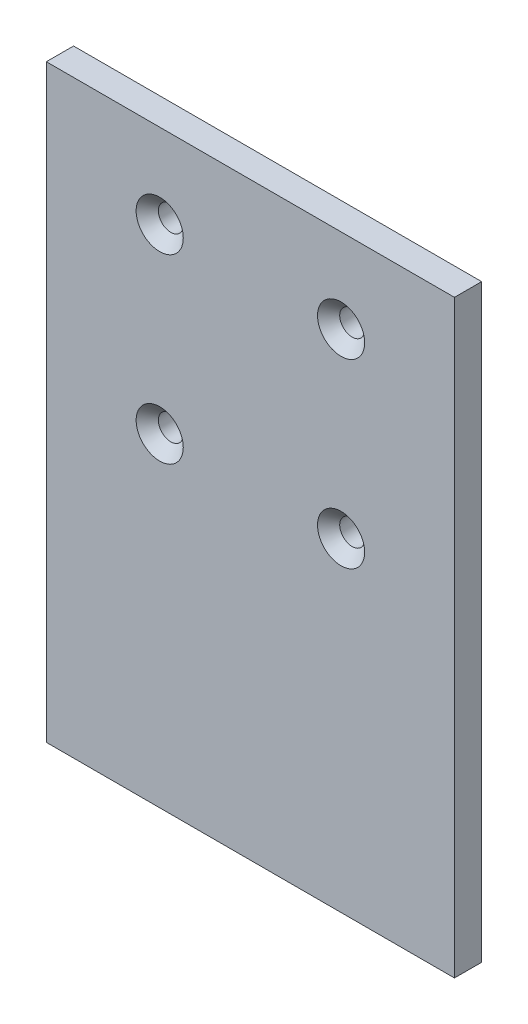
ISO-10303-21;
HEADER;
FILE_DESCRIPTION(('STEP AP214'),'2;1');
FILE_NAME('part.step','',(''),(''),'','','');
FILE_SCHEMA(('AUTOMOTIVE_DESIGN { 1 0 10303 214 1 1 1 1 }'));
ENDSEC;
DATA;
#1=APPLICATION_CONTEXT('core data for automotive mechanical design processes');
#2=APPLICATION_PROTOCOL_DEFINITION('international standard','automotive_design',2000,#1);
#3=PRODUCT_CONTEXT('',#1,'mechanical');
#4=PRODUCT('Part','Part','',(#3));
#5=PRODUCT_RELATED_PRODUCT_CATEGORY('part','',(#4));
#6=PRODUCT_DEFINITION_FORMATION('','',#4);
#7=PRODUCT_DEFINITION_CONTEXT('part definition',#1,'design');
#8=PRODUCT_DEFINITION('design','',#6,#7);
#9=PRODUCT_DEFINITION_SHAPE('','',#8);
#10=(LENGTH_UNIT() NAMED_UNIT(*) SI_UNIT(.MILLI.,.METRE.));
#11=(NAMED_UNIT(*) PLANE_ANGLE_UNIT() SI_UNIT($,.RADIAN.));
#12=(NAMED_UNIT(*) SI_UNIT($,.STERADIAN.) SOLID_ANGLE_UNIT());
#13=UNCERTAINTY_MEASURE_WITH_UNIT(LENGTH_MEASURE(1.E-05),#10,'distance_accuracy_value','');
#14=(GEOMETRIC_REPRESENTATION_CONTEXT(3) GLOBAL_UNCERTAINTY_ASSIGNED_CONTEXT((#13)) GLOBAL_UNIT_ASSIGNED_CONTEXT((#10,
#11,#12)) REPRESENTATION_CONTEXT('',''));
#15=CARTESIAN_POINT('',(0.,0.,0.));
#16=DIRECTION('',(0.,0.,1.));
#17=DIRECTION('',(1.,0.,0.));
#18=AXIS2_PLACEMENT_3D('',#15,#16,#17);
#19=CARTESIAN_POINT('',(0.,0.,3.));
#20=DIRECTION('',(0.,0.,1.));
#21=DIRECTION('',(1.,0.,0.));
#22=AXIS2_PLACEMENT_3D('',#19,#20,#21);
#23=PLANE('',#22);
#24=DIRECTION('',(1.,0.,0.));
#25=VECTOR('',#24,1.);
#26=CARTESIAN_POINT('',(-45.,-65.,3.));
#27=LINE('',#26,#25);
#28=CARTESIAN_POINT('',(-45.,-65.,3.));
#29=VERTEX_POINT('',#28);
#30=CARTESIAN_POINT('',(45.,-65.,3.));
#31=VERTEX_POINT('',#30);
#32=EDGE_CURVE('E10',#29,#31,#27,.T.);
#33=ORIENTED_EDGE('',*,*,#32,.T.);
#34=DIRECTION('',(0.,1.,0.));
#35=VECTOR('',#34,1.);
#36=CARTESIAN_POINT('',(45.,-65.,3.));
#37=LINE('',#36,#35);
#38=CARTESIAN_POINT('',(45.,65.,3.));
#39=VERTEX_POINT('',#38);
#40=EDGE_CURVE('E37',#31,#39,#37,.T.);
#41=ORIENTED_EDGE('',*,*,#40,.T.);
#42=DIRECTION('',(-1.,0.,0.));
#43=VECTOR('',#42,1.);
#44=CARTESIAN_POINT('',(45.,65.,3.));
#45=LINE('',#44,#43);
#46=CARTESIAN_POINT('',(-45.,65.,3.));
#47=VERTEX_POINT('',#46);
#48=EDGE_CURVE('E112',#39,#47,#45,.T.);
#49=ORIENTED_EDGE('',*,*,#48,.T.);
#50=DIRECTION('',(0.,-1.,0.));
#51=VECTOR('',#50,1.);
#52=CARTESIAN_POINT('',(-45.,65.,3.));
#53=LINE('',#52,#51);
#54=EDGE_CURVE('E19',#47,#29,#53,.T.);
#55=ORIENTED_EDGE('',*,*,#54,.T.);
#56=EDGE_LOOP('',(#33,#41,#49,#55));
#57=FACE_BOUND('',#56,.T.);
#58=CARTESIAN_POINT('',(19.9999999999991,6.42500000000307,3.));
#59=DIRECTION('',(0.,0.,-1.));
#60=DIRECTION('',(1.,0.,0.));
#61=AXIS2_PLACEMENT_3D('',#58,#59,#60);
#62=CIRCLE('',#61,5.2);
#63=CARTESIAN_POINT('',(25.1999999999991,6.42500000000307,3.));
#64=VERTEX_POINT('',#63);
#65=EDGE_CURVE('E98',#64,#64,#62,.T.);
#66=ORIENTED_EDGE('',*,*,#65,.T.);
#67=EDGE_LOOP('',(#66));
#68=FACE_BOUND('',#67,.T.);
#69=CARTESIAN_POINT('',(19.9999999999991,46.4250000000011,3.));
#70=DIRECTION('',(0.,0.,-1.));
#71=DIRECTION('',(1.,0.,0.));
#72=AXIS2_PLACEMENT_3D('',#69,#70,#71);
#73=CIRCLE('',#72,5.2);
#74=CARTESIAN_POINT('',(25.1999999999991,46.4250000000011,3.));
#75=VERTEX_POINT('',#74);
#76=EDGE_CURVE('E80',#75,#75,#73,.T.);
#77=ORIENTED_EDGE('',*,*,#76,.T.);
#78=EDGE_LOOP('',(#77));
#79=FACE_BOUND('',#78,.T.);
#80=CARTESIAN_POINT('',(-19.999999999999,46.4250000000011,3.));
#81=DIRECTION('',(0.,0.,-1.));
#82=DIRECTION('',(1.,0.,0.));
#83=AXIS2_PLACEMENT_3D('',#80,#81,#82);
#84=CIRCLE('',#83,5.2);
#85=CARTESIAN_POINT('',(-14.799999999999,46.4250000000011,3.));
#86=VERTEX_POINT('',#85);
#87=EDGE_CURVE('E120',#86,#86,#84,.T.);
#88=ORIENTED_EDGE('',*,*,#87,.T.);
#89=EDGE_LOOP('',(#88));
#90=FACE_BOUND('',#89,.T.);
#91=CARTESIAN_POINT('',(-19.999999999999,6.42500000000309,3.));
#92=DIRECTION('',(0.,0.,-1.));
#93=DIRECTION('',(1.,0.,0.));
#94=AXIS2_PLACEMENT_3D('',#91,#92,#93);
#95=CIRCLE('',#94,5.2);
#96=CARTESIAN_POINT('',(-14.799999999999,6.42500000000309,3.));
#97=VERTEX_POINT('',#96);
#98=EDGE_CURVE('E92',#97,#97,#95,.T.);
#99=ORIENTED_EDGE('',*,*,#98,.T.);
#100=EDGE_LOOP('',(#99));
#101=FACE_BOUND('',#100,.T.);
#102=ADVANCED_FACE('F15',(#57,#68,#79,#90,#101),#23,.T.);
#103=CARTESIAN_POINT('',(-45.,-65.,0.));
#104=DIRECTION('',(0.,-1.,0.));
#105=DIRECTION('',(1.,0.,0.));
#106=AXIS2_PLACEMENT_3D('',#103,#104,#105);
#107=PLANE('',#106);
#108=DIRECTION('',(0.,0.,1.));
#109=VECTOR('',#108,1.);
#110=CARTESIAN_POINT('',(45.,-65.,0.));
#111=LINE('',#110,#109);
#112=CARTESIAN_POINT('',(45.,-65.,-3.));
#113=VERTEX_POINT('',#112);
#114=EDGE_CURVE('E25',#113,#31,#111,.T.);
#115=ORIENTED_EDGE('',*,*,#114,.T.);
#116=ORIENTED_EDGE('',*,*,#32,.F.);
#117=DIRECTION('',(0.,0.,-1.));
#118=VECTOR('',#117,1.);
#119=CARTESIAN_POINT('',(-45.,-65.,0.));
#120=LINE('',#119,#118);
#121=CARTESIAN_POINT('',(-45.,-65.,-3.));
#122=VERTEX_POINT('',#121);
#123=EDGE_CURVE('E54',#29,#122,#120,.T.);
#124=ORIENTED_EDGE('',*,*,#123,.T.);
#125=DIRECTION('',(-1.,0.,0.));
#126=VECTOR('',#125,1.);
#127=CARTESIAN_POINT('',(-45.,-65.,-3.));
#128=LINE('',#127,#126);
#129=EDGE_CURVE('E111',#113,#122,#128,.T.);
#130=ORIENTED_EDGE('',*,*,#129,.F.);
#131=EDGE_LOOP('',(#115,#116,#124,#130));
#132=FACE_BOUND('',#131,.T.);
#133=ADVANCED_FACE('F163',(#132),#107,.T.);
#134=CARTESIAN_POINT('',(45.,-65.,0.));
#135=DIRECTION('',(1.,0.,0.));
#136=DIRECTION('',(0.,1.,0.));
#137=AXIS2_PLACEMENT_3D('',#134,#135,#136);
#138=PLANE('',#137);
#139=DIRECTION('',(0.,0.,1.));
#140=VECTOR('',#139,1.);
#141=CARTESIAN_POINT('',(45.,65.,0.));
#142=LINE('',#141,#140);
#143=CARTESIAN_POINT('',(45.,65.,-3.));
#144=VERTEX_POINT('',#143);
#145=EDGE_CURVE('E115',#144,#39,#142,.T.);
#146=ORIENTED_EDGE('',*,*,#145,.T.);
#147=ORIENTED_EDGE('',*,*,#40,.F.);
#148=ORIENTED_EDGE('',*,*,#114,.F.);
#149=DIRECTION('',(0.,-1.,0.));
#150=VECTOR('',#149,1.);
#151=CARTESIAN_POINT('',(45.,-65.,-3.));
#152=LINE('',#151,#150);
#153=EDGE_CURVE('E134',#144,#113,#152,.T.);
#154=ORIENTED_EDGE('',*,*,#153,.F.);
#155=EDGE_LOOP('',(#146,#147,#148,#154));
#156=FACE_BOUND('',#155,.T.);
#157=ADVANCED_FACE('F164',(#156),#138,.T.);
#158=CARTESIAN_POINT('',(45.,65.,0.));
#159=DIRECTION('',(0.,1.,0.));
#160=DIRECTION('',(-1.,0.,0.));
#161=AXIS2_PLACEMENT_3D('',#158,#159,#160);
#162=PLANE('',#161);
#163=DIRECTION('',(0.,0.,1.));
#164=VECTOR('',#163,1.);
#165=CARTESIAN_POINT('',(-45.,65.,0.));
#166=LINE('',#165,#164);
#167=CARTESIAN_POINT('',(-45.,65.,-3.));
#168=VERTEX_POINT('',#167);
#169=EDGE_CURVE('E116',#168,#47,#166,.T.);
#170=ORIENTED_EDGE('',*,*,#169,.T.);
#171=ORIENTED_EDGE('',*,*,#48,.F.);
#172=ORIENTED_EDGE('',*,*,#145,.F.);
#173=DIRECTION('',(1.,0.,0.));
#174=VECTOR('',#173,1.);
#175=CARTESIAN_POINT('',(45.,65.,-3.));
#176=LINE('',#175,#174);
#177=EDGE_CURVE('E110',#168,#144,#176,.T.);
#178=ORIENTED_EDGE('',*,*,#177,.F.);
#179=EDGE_LOOP('',(#170,#171,#172,#178));
#180=FACE_BOUND('',#179,.T.);
#181=ADVANCED_FACE('F166',(#180),#162,.T.);
#182=CARTESIAN_POINT('',(-45.,65.,0.));
#183=DIRECTION('',(-1.,0.,0.));
#184=DIRECTION('',(0.,-1.,0.));
#185=AXIS2_PLACEMENT_3D('',#182,#183,#184);
#186=PLANE('',#185);
#187=ORIENTED_EDGE('',*,*,#123,.F.);
#188=ORIENTED_EDGE('',*,*,#54,.F.);
#189=ORIENTED_EDGE('',*,*,#169,.F.);
#190=DIRECTION('',(0.,1.,0.));
#191=VECTOR('',#190,1.);
#192=CARTESIAN_POINT('',(-45.,65.,-3.));
#193=LINE('',#192,#191);
#194=EDGE_CURVE('E106',#122,#168,#193,.T.);
#195=ORIENTED_EDGE('',*,*,#194,.F.);
#196=EDGE_LOOP('',(#187,#188,#189,#195));
#197=FACE_BOUND('',#196,.T.);
#198=ADVANCED_FACE('F158',(#197),#186,.T.);
#199=CARTESIAN_POINT('',(0.,0.,-3.));
#200=DIRECTION('',(0.,0.,-1.));
#201=DIRECTION('',(-1.,0.,0.));
#202=AXIS2_PLACEMENT_3D('',#199,#200,#201);
#203=PLANE('',#202);
#204=ORIENTED_EDGE('',*,*,#129,.T.);
#205=ORIENTED_EDGE('',*,*,#194,.T.);
#206=ORIENTED_EDGE('',*,*,#177,.T.);
#207=ORIENTED_EDGE('',*,*,#153,.T.);
#208=EDGE_LOOP('',(#204,#205,#206,#207));
#209=FACE_BOUND('',#208,.T.);
#210=CARTESIAN_POINT('',(19.9999999999991,6.42500000000307,-3.));
#211=DIRECTION('',(0.,0.,1.));
#212=DIRECTION('',(1.,0.,0.));
#213=AXIS2_PLACEMENT_3D('',#210,#211,#212);
#214=CIRCLE('',#213,2.75);
#215=CARTESIAN_POINT('',(17.2499999999991,6.42500000000307,-3.));
#216=VERTEX_POINT('',#215);
#217=EDGE_CURVE('E105',#216,#216,#214,.T.);
#218=ORIENTED_EDGE('',*,*,#217,.T.);
#219=EDGE_LOOP('',(#218));
#220=FACE_BOUND('',#219,.T.);
#221=CARTESIAN_POINT('',(19.9999999999991,46.4250000000011,-3.));
#222=DIRECTION('',(0.,0.,1.));
#223=DIRECTION('',(1.,0.,0.));
#224=AXIS2_PLACEMENT_3D('',#221,#222,#223);
#225=CIRCLE('',#224,2.75);
#226=CARTESIAN_POINT('',(17.2499999999991,46.4250000000011,-3.));
#227=VERTEX_POINT('',#226);
#228=EDGE_CURVE('E87',#227,#227,#225,.T.);
#229=ORIENTED_EDGE('',*,*,#228,.T.);
#230=EDGE_LOOP('',(#229));
#231=FACE_BOUND('',#230,.T.);
#232=CARTESIAN_POINT('',(-19.999999999999,46.4250000000011,-3.));
#233=DIRECTION('',(0.,0.,1.));
#234=DIRECTION('',(1.,0.,0.));
#235=AXIS2_PLACEMENT_3D('',#232,#233,#234);
#236=CIRCLE('',#235,2.75);
#237=CARTESIAN_POINT('',(-22.7499999999991,46.4250000000011,-3.));
#238=VERTEX_POINT('',#237);
#239=EDGE_CURVE('E84',#238,#238,#236,.T.);
#240=ORIENTED_EDGE('',*,*,#239,.T.);
#241=EDGE_LOOP('',(#240));
#242=FACE_BOUND('',#241,.T.);
#243=CARTESIAN_POINT('',(-19.999999999999,6.42500000000309,-3.));
#244=DIRECTION('',(0.,0.,1.));
#245=DIRECTION('',(1.,0.,0.));
#246=AXIS2_PLACEMENT_3D('',#243,#244,#245);
#247=CIRCLE('',#246,2.75);
#248=CARTESIAN_POINT('',(-22.749999999999,6.42500000000309,-3.));
#249=VERTEX_POINT('',#248);
#250=EDGE_CURVE('E117',#249,#249,#247,.T.);
#251=ORIENTED_EDGE('',*,*,#250,.T.);
#252=EDGE_LOOP('',(#251));
#253=FACE_BOUND('',#252,.T.);
#254=ADVANCED_FACE('F161',(#209,#220,#231,#242,#253),#203,.T.);
#255=CARTESIAN_POINT('',(19.9999999999991,6.42500000000307,-155.227684050548));
#256=DIRECTION('',(0.,0.,-1.));
#257=DIRECTION('',(1.,0.,0.));
#258=AXIS2_PLACEMENT_3D('',#255,#256,#257);
#259=CYLINDRICAL_SURFACE('',#258,2.75);
#260=CARTESIAN_POINT('',(19.9999999999991,6.42500000000307,0.550000000000008));
#261=DIRECTION('',(0.,0.,1.));
#262=DIRECTION('',(1.,0.,0.));
#263=AXIS2_PLACEMENT_3D('',#260,#261,#262);
#264=CIRCLE('',#263,2.75);
#265=CARTESIAN_POINT('',(22.7499999999991,6.42500000000307,0.55));
#266=VERTEX_POINT('',#265);
#267=EDGE_CURVE('E101',#266,#266,#264,.T.);
#268=ORIENTED_EDGE('',*,*,#267,.T.);
#269=EDGE_LOOP('',(#268));
#270=FACE_BOUND('',#269,.T.);
#271=ORIENTED_EDGE('',*,*,#217,.F.);
#272=EDGE_LOOP('',(#271));
#273=FACE_BOUND('',#272,.T.);
#274=ADVANCED_FACE('F207',(#270,#273),#259,.F.);
#275=CARTESIAN_POINT('',(19.9999999999991,6.42500000000307,1.775));
#276=DIRECTION('',(0.,0.,1.));
#277=DIRECTION('',(1.,0.,0.));
#278=AXIS2_PLACEMENT_3D('',#275,#276,#277);
#279=CONICAL_SURFACE('',#278,3.975,0.785398163397448);
#280=ORIENTED_EDGE('',*,*,#267,.F.);
#281=EDGE_LOOP('',(#280));
#282=FACE_BOUND('',#281,.T.);
#283=ORIENTED_EDGE('',*,*,#65,.F.);
#284=EDGE_LOOP('',(#283));
#285=FACE_BOUND('',#284,.T.);
#286=ADVANCED_FACE('F200',(#282,#285),#279,.F.);
#287=CARTESIAN_POINT('',(19.9999999999991,46.4250000000011,-155.227684050548));
#288=DIRECTION('',(0.,0.,-1.));
#289=DIRECTION('',(1.,0.,0.));
#290=AXIS2_PLACEMENT_3D('',#287,#288,#289);
#291=CYLINDRICAL_SURFACE('',#290,2.75);
#292=CARTESIAN_POINT('',(19.9999999999991,46.4250000000011,0.550000000000008));
#293=DIRECTION('',(0.,0.,1.));
#294=DIRECTION('',(1.,0.,0.));
#295=AXIS2_PLACEMENT_3D('',#292,#293,#294);
#296=CIRCLE('',#295,2.75);
#297=CARTESIAN_POINT('',(22.7499999999991,46.4250000000011,0.55));
#298=VERTEX_POINT('',#297);
#299=EDGE_CURVE('E83',#298,#298,#296,.T.);
#300=ORIENTED_EDGE('',*,*,#299,.T.);
#301=EDGE_LOOP('',(#300));
#302=FACE_BOUND('',#301,.T.);
#303=ORIENTED_EDGE('',*,*,#228,.F.);
#304=EDGE_LOOP('',(#303));
#305=FACE_BOUND('',#304,.T.);
#306=ADVANCED_FACE('F198',(#302,#305),#291,.F.);
#307=CARTESIAN_POINT('',(19.9999999999991,46.4250000000011,1.775));
#308=DIRECTION('',(0.,0.,1.));
#309=DIRECTION('',(1.,0.,0.));
#310=AXIS2_PLACEMENT_3D('',#307,#308,#309);
#311=CONICAL_SURFACE('',#310,3.975,0.785398163397448);
#312=ORIENTED_EDGE('',*,*,#299,.F.);
#313=EDGE_LOOP('',(#312));
#314=FACE_BOUND('',#313,.T.);
#315=ORIENTED_EDGE('',*,*,#76,.F.);
#316=EDGE_LOOP('',(#315));
#317=FACE_BOUND('',#316,.T.);
#318=ADVANCED_FACE('F189',(#314,#317),#311,.F.);
#319=CARTESIAN_POINT('',(-19.999999999999,46.4250000000011,-155.227684050548));
#320=DIRECTION('',(0.,0.,-1.));
#321=DIRECTION('',(1.,0.,0.));
#322=AXIS2_PLACEMENT_3D('',#319,#320,#321);
#323=CYLINDRICAL_SURFACE('',#322,2.75);
#324=CARTESIAN_POINT('',(-19.999999999999,46.4250000000011,0.550000000000008));
#325=DIRECTION('',(0.,0.,1.));
#326=DIRECTION('',(1.,0.,0.));
#327=AXIS2_PLACEMENT_3D('',#324,#325,#326);
#328=CIRCLE('',#327,2.75);
#329=CARTESIAN_POINT('',(-17.249999999999,46.4250000000011,0.55));
#330=VERTEX_POINT('',#329);
#331=EDGE_CURVE('E89',#330,#330,#328,.T.);
#332=ORIENTED_EDGE('',*,*,#331,.T.);
#333=EDGE_LOOP('',(#332));
#334=FACE_BOUND('',#333,.T.);
#335=ORIENTED_EDGE('',*,*,#239,.F.);
#336=EDGE_LOOP('',(#335));
#337=FACE_BOUND('',#336,.T.);
#338=ADVANCED_FACE('F186',(#334,#337),#323,.F.);
#339=CARTESIAN_POINT('',(-19.999999999999,46.4250000000011,1.775));
#340=DIRECTION('',(0.,0.,1.));
#341=DIRECTION('',(1.,0.,0.));
#342=AXIS2_PLACEMENT_3D('',#339,#340,#341);
#343=CONICAL_SURFACE('',#342,3.975,0.785398163397448);
#344=ORIENTED_EDGE('',*,*,#331,.F.);
#345=EDGE_LOOP('',(#344));
#346=FACE_BOUND('',#345,.T.);
#347=ORIENTED_EDGE('',*,*,#87,.F.);
#348=EDGE_LOOP('',(#347));
#349=FACE_BOUND('',#348,.T.);
#350=ADVANCED_FACE('F17',(#346,#349),#343,.F.);
#351=CARTESIAN_POINT('',(-19.999999999999,6.42500000000309,-155.227684050548));
#352=DIRECTION('',(0.,0.,-1.));
#353=DIRECTION('',(1.,0.,0.));
#354=AXIS2_PLACEMENT_3D('',#351,#352,#353);
#355=CYLINDRICAL_SURFACE('',#354,2.75);
#356=CARTESIAN_POINT('',(-19.999999999999,6.42500000000309,0.550000000000008));
#357=DIRECTION('',(0.,0.,1.));
#358=DIRECTION('',(1.,0.,0.));
#359=AXIS2_PLACEMENT_3D('',#356,#357,#358);
#360=CIRCLE('',#359,2.75);
#361=CARTESIAN_POINT('',(-17.249999999999,6.42500000000309,0.55));
#362=VERTEX_POINT('',#361);
#363=EDGE_CURVE('E95',#362,#362,#360,.T.);
#364=ORIENTED_EDGE('',*,*,#363,.T.);
#365=EDGE_LOOP('',(#364));
#366=FACE_BOUND('',#365,.T.);
#367=ORIENTED_EDGE('',*,*,#250,.F.);
#368=EDGE_LOOP('',(#367));
#369=FACE_BOUND('',#368,.T.);
#370=ADVANCED_FACE('F193',(#366,#369),#355,.F.);
#371=CARTESIAN_POINT('',(-19.999999999999,6.42500000000309,1.775));
#372=DIRECTION('',(0.,0.,1.));
#373=DIRECTION('',(1.,0.,0.));
#374=AXIS2_PLACEMENT_3D('',#371,#372,#373);
#375=CONICAL_SURFACE('',#374,3.975,0.785398163397448);
#376=ORIENTED_EDGE('',*,*,#363,.F.);
#377=EDGE_LOOP('',(#376));
#378=FACE_BOUND('',#377,.T.);
#379=ORIENTED_EDGE('',*,*,#98,.F.);
#380=EDGE_LOOP('',(#379));
#381=FACE_BOUND('',#380,.T.);
#382=ADVANCED_FACE('F191',(#378,#381),#375,.F.);
#383=CLOSED_SHELL('',(#102,#133,#157,#181,#198,#254,#274,#286,#306,#318,#338,#350,#370,#382));
#384=MANIFOLD_SOLID_BREP('B1',#383);
#385=ADVANCED_BREP_SHAPE_REPRESENTATION('',(#18,#384),#14);
#386=SHAPE_DEFINITION_REPRESENTATION(#9,#385);
ENDSEC;
END-ISO-10303-21;
